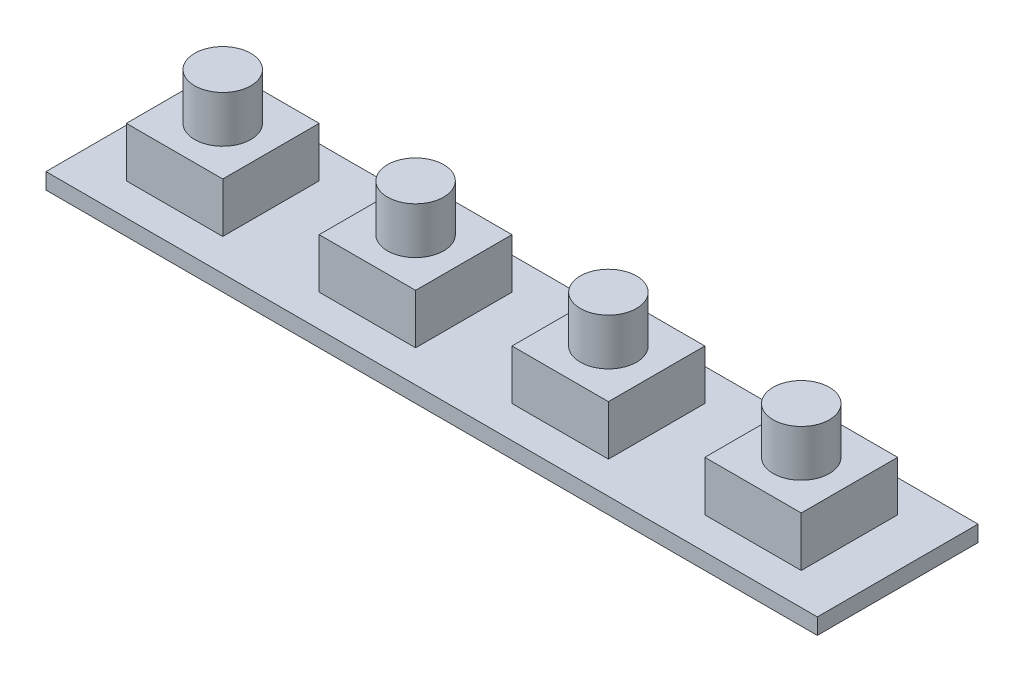
ISO-10303-21;
HEADER;
FILE_DESCRIPTION(('STEP AP214'),'2;1');
FILE_NAME('part.step','',(''),(''),'','','');
FILE_SCHEMA(('AUTOMOTIVE_DESIGN { 1 0 10303 214 1 1 1 1 }'));
ENDSEC;
DATA;
#1=APPLICATION_CONTEXT('core data for automotive mechanical design processes');
#2=APPLICATION_PROTOCOL_DEFINITION('international standard','automotive_design',2000,#1);
#3=PRODUCT_CONTEXT('',#1,'mechanical');
#4=PRODUCT('Part','Part','',(#3));
#5=PRODUCT_RELATED_PRODUCT_CATEGORY('part','',(#4));
#6=PRODUCT_DEFINITION_FORMATION('','',#4);
#7=PRODUCT_DEFINITION_CONTEXT('part definition',#1,'design');
#8=PRODUCT_DEFINITION('design','',#6,#7);
#9=PRODUCT_DEFINITION_SHAPE('','',#8);
#10=(LENGTH_UNIT() NAMED_UNIT(*) SI_UNIT(.MILLI.,.METRE.));
#11=(NAMED_UNIT(*) PLANE_ANGLE_UNIT() SI_UNIT($,.RADIAN.));
#12=(NAMED_UNIT(*) SI_UNIT($,.STERADIAN.) SOLID_ANGLE_UNIT());
#13=UNCERTAINTY_MEASURE_WITH_UNIT(LENGTH_MEASURE(1.E-05),#10,'distance_accuracy_value','');
#14=(GEOMETRIC_REPRESENTATION_CONTEXT(3) GLOBAL_UNCERTAINTY_ASSIGNED_CONTEXT((#13)) GLOBAL_UNIT_ASSIGNED_CONTEXT((#10,
#11,#12)) REPRESENTATION_CONTEXT('',''));
#15=CARTESIAN_POINT('',(0.,0.,0.));
#16=DIRECTION('',(0.,0.,1.));
#17=DIRECTION('',(1.,0.,0.));
#18=AXIS2_PLACEMENT_3D('',#15,#16,#17);
#19=CARTESIAN_POINT('',(0.,1.,0.));
#20=DIRECTION('',(0.,1.,0.));
#21=DIRECTION('',(0.,0.,1.));
#22=AXIS2_PLACEMENT_3D('',#19,#20,#21);
#23=PLANE('',#22);
#24=DIRECTION('',(0.,0.,-1.));
#25=VECTOR('',#24,1.);
#26=CARTESIAN_POINT('',(24.,1.,-5.));
#27=LINE('',#26,#25);
#28=CARTESIAN_POINT('',(24.,1.,5.));
#29=VERTEX_POINT('',#28);
#30=CARTESIAN_POINT('',(24.,1.,-5.));
#31=VERTEX_POINT('',#30);
#32=EDGE_CURVE('E311',#29,#31,#27,.T.);
#33=ORIENTED_EDGE('',*,*,#32,.T.);
#34=DIRECTION('',(-1.,0.,0.));
#35=VECTOR('',#34,1.);
#36=CARTESIAN_POINT('',(-24.,1.,-5.));
#37=LINE('',#36,#35);
#38=CARTESIAN_POINT('',(-24.,1.,-5.));
#39=VERTEX_POINT('',#38);
#40=EDGE_CURVE('E314',#31,#39,#37,.T.);
#41=ORIENTED_EDGE('',*,*,#40,.T.);
#42=DIRECTION('',(0.,0.,1.));
#43=VECTOR('',#42,1.);
#44=CARTESIAN_POINT('',(-24.,1.,-5.));
#45=LINE('',#44,#43);
#46=CARTESIAN_POINT('',(-24.,1.,5.));
#47=VERTEX_POINT('',#46);
#48=EDGE_CURVE('E317',#39,#47,#45,.T.);
#49=ORIENTED_EDGE('',*,*,#48,.T.);
#50=DIRECTION('',(1.,0.,0.));
#51=VECTOR('',#50,1.);
#52=CARTESIAN_POINT('',(-24.,1.,5.));
#53=LINE('',#52,#51);
#54=EDGE_CURVE('E319',#47,#29,#53,.T.);
#55=ORIENTED_EDGE('',*,*,#54,.T.);
#56=EDGE_LOOP('',(#33,#41,#49,#55));
#57=FACE_BOUND('',#56,.T.);
#58=DIRECTION('',(-1.,0.,0.));
#59=VECTOR('',#58,1.);
#60=CARTESIAN_POINT('',(-21.,1.,-3.));
#61=LINE('',#60,#59);
#62=CARTESIAN_POINT('',(-15.,1.,-3.));
#63=VERTEX_POINT('',#62);
#64=CARTESIAN_POINT('',(-21.,1.,-3.));
#65=VERTEX_POINT('',#64);
#66=EDGE_CURVE('E293',#63,#65,#61,.T.);
#67=ORIENTED_EDGE('',*,*,#66,.F.);
#68=DIRECTION('',(0.,0.,-1.));
#69=VECTOR('',#68,1.);
#70=CARTESIAN_POINT('',(-15.,1.,-3.));
#71=LINE('',#70,#69);
#72=CARTESIAN_POINT('',(-15.,1.,3.));
#73=VERTEX_POINT('',#72);
#74=EDGE_CURVE('E290',#73,#63,#71,.T.);
#75=ORIENTED_EDGE('',*,*,#74,.F.);
#76=DIRECTION('',(1.,0.,0.));
#77=VECTOR('',#76,1.);
#78=CARTESIAN_POINT('',(-21.,1.,3.));
#79=LINE('',#78,#77);
#80=CARTESIAN_POINT('',(-21.,1.,3.));
#81=VERTEX_POINT('',#80);
#82=EDGE_CURVE('E298',#81,#73,#79,.T.);
#83=ORIENTED_EDGE('',*,*,#82,.F.);
#84=DIRECTION('',(0.,0.,1.));
#85=VECTOR('',#84,1.);
#86=CARTESIAN_POINT('',(-21.,1.,-3.));
#87=LINE('',#86,#85);
#88=EDGE_CURVE('E295',#65,#81,#87,.T.);
#89=ORIENTED_EDGE('',*,*,#88,.F.);
#90=EDGE_LOOP('',(#67,#75,#83,#89));
#91=FACE_BOUND('',#90,.T.);
#92=DIRECTION('',(-1.,0.,0.));
#93=VECTOR('',#92,1.);
#94=CARTESIAN_POINT('',(-9.00000000000003,1.,-3.));
#95=LINE('',#94,#93);
#96=CARTESIAN_POINT('',(-3.00000000000003,1.,-3.));
#97=VERTEX_POINT('',#96);
#98=CARTESIAN_POINT('',(-9.00000000000003,1.,-3.));
#99=VERTEX_POINT('',#98);
#100=EDGE_CURVE('E273',#97,#99,#95,.T.);
#101=ORIENTED_EDGE('',*,*,#100,.F.);
#102=DIRECTION('',(0.,0.,-1.));
#103=VECTOR('',#102,1.);
#104=CARTESIAN_POINT('',(-3.00000000000003,1.,-3.));
#105=LINE('',#104,#103);
#106=CARTESIAN_POINT('',(-3.00000000000003,1.,3.));
#107=VERTEX_POINT('',#106);
#108=EDGE_CURVE('E270',#107,#97,#105,.T.);
#109=ORIENTED_EDGE('',*,*,#108,.F.);
#110=DIRECTION('',(1.,0.,0.));
#111=VECTOR('',#110,1.);
#112=CARTESIAN_POINT('',(-9.00000000000003,1.,3.));
#113=LINE('',#112,#111);
#114=CARTESIAN_POINT('',(-9.00000000000003,1.,3.));
#115=VERTEX_POINT('',#114);
#116=EDGE_CURVE('E278',#115,#107,#113,.T.);
#117=ORIENTED_EDGE('',*,*,#116,.F.);
#118=DIRECTION('',(0.,0.,1.));
#119=VECTOR('',#118,1.);
#120=CARTESIAN_POINT('',(-9.00000000000003,1.,-3.));
#121=LINE('',#120,#119);
#122=EDGE_CURVE('E275',#99,#115,#121,.T.);
#123=ORIENTED_EDGE('',*,*,#122,.F.);
#124=EDGE_LOOP('',(#101,#109,#117,#123));
#125=FACE_BOUND('',#124,.T.);
#126=DIRECTION('',(-1.,0.,0.));
#127=VECTOR('',#126,1.);
#128=CARTESIAN_POINT('',(2.99999999999998,1.,-3.));
#129=LINE('',#128,#127);
#130=CARTESIAN_POINT('',(8.99999999999998,1.,-3.));
#131=VERTEX_POINT('',#130);
#132=CARTESIAN_POINT('',(2.99999999999998,1.,-3.));
#133=VERTEX_POINT('',#132);
#134=EDGE_CURVE('E255',#131,#133,#129,.T.);
#135=ORIENTED_EDGE('',*,*,#134,.F.);
#136=DIRECTION('',(0.,0.,-1.));
#137=VECTOR('',#136,1.);
#138=CARTESIAN_POINT('',(8.99999999999998,1.,-3.));
#139=LINE('',#138,#137);
#140=CARTESIAN_POINT('',(8.99999999999998,1.,3.));
#141=VERTEX_POINT('',#140);
#142=EDGE_CURVE('E182',#141,#131,#139,.T.);
#143=ORIENTED_EDGE('',*,*,#142,.F.);
#144=DIRECTION('',(1.,0.,0.));
#145=VECTOR('',#144,1.);
#146=CARTESIAN_POINT('',(2.99999999999998,1.,3.));
#147=LINE('',#146,#145);
#148=CARTESIAN_POINT('',(2.99999999999998,1.,3.));
#149=VERTEX_POINT('',#148);
#150=EDGE_CURVE('E259',#149,#141,#147,.T.);
#151=ORIENTED_EDGE('',*,*,#150,.F.);
#152=DIRECTION('',(0.,0.,1.));
#153=VECTOR('',#152,1.);
#154=CARTESIAN_POINT('',(2.99999999999998,1.,-3.));
#155=LINE('',#154,#153);
#156=EDGE_CURVE('E257',#133,#149,#155,.T.);
#157=ORIENTED_EDGE('',*,*,#156,.F.);
#158=EDGE_LOOP('',(#135,#143,#151,#157));
#159=FACE_BOUND('',#158,.T.);
#160=DIRECTION('',(-1.,0.,0.));
#161=VECTOR('',#160,1.);
#162=CARTESIAN_POINT('',(15.,1.,-3.));
#163=LINE('',#162,#161);
#164=CARTESIAN_POINT('',(21.,1.,-3.));
#165=VERTEX_POINT('',#164);
#166=CARTESIAN_POINT('',(15.,1.,-3.));
#167=VERTEX_POINT('',#166);
#168=EDGE_CURVE('E243',#165,#167,#163,.T.);
#169=ORIENTED_EDGE('',*,*,#168,.F.);
#170=DIRECTION('',(0.,0.,-1.));
#171=VECTOR('',#170,1.);
#172=CARTESIAN_POINT('',(21.,1.,-3.));
#173=LINE('',#172,#171);
#174=CARTESIAN_POINT('',(21.,1.,3.));
#175=VERTEX_POINT('',#174);
#176=EDGE_CURVE('E179',#175,#165,#173,.T.);
#177=ORIENTED_EDGE('',*,*,#176,.F.);
#178=DIRECTION('',(1.,0.,0.));
#179=VECTOR('',#178,1.);
#180=CARTESIAN_POINT('',(15.,1.,3.));
#181=LINE('',#180,#179);
#182=CARTESIAN_POINT('',(15.,1.,3.));
#183=VERTEX_POINT('',#182);
#184=EDGE_CURVE('E247',#183,#175,#181,.T.);
#185=ORIENTED_EDGE('',*,*,#184,.F.);
#186=DIRECTION('',(0.,0.,1.));
#187=VECTOR('',#186,1.);
#188=CARTESIAN_POINT('',(15.,1.,-3.));
#189=LINE('',#188,#187);
#190=EDGE_CURVE('E245',#167,#183,#189,.T.);
#191=ORIENTED_EDGE('',*,*,#190,.F.);
#192=EDGE_LOOP('',(#169,#177,#185,#191));
#193=FACE_BOUND('',#192,.T.);
#194=ADVANCED_FACE('F35',(#57,#91,#125,#159,#193),#23,.T.);
#195=CARTESIAN_POINT('',(24.,1.,-5.));
#196=DIRECTION('',(-1.,0.,0.));
#197=DIRECTION('',(0.,0.,1.));
#198=AXIS2_PLACEMENT_3D('',#195,#196,#197);
#199=PLANE('',#198);
#200=DIRECTION('',(0.,0.,-1.));
#201=VECTOR('',#200,1.);
#202=CARTESIAN_POINT('',(24.,0.,-5.));
#203=LINE('',#202,#201);
#204=CARTESIAN_POINT('',(24.,0.,5.));
#205=VERTEX_POINT('',#204);
#206=CARTESIAN_POINT('',(24.,0.,-5.));
#207=VERTEX_POINT('',#206);
#208=EDGE_CURVE('E310',#205,#207,#203,.T.);
#209=ORIENTED_EDGE('',*,*,#208,.T.);
#210=DIRECTION('',(0.,-1.,0.));
#211=VECTOR('',#210,1.);
#212=CARTESIAN_POINT('',(24.,1.,-5.));
#213=LINE('',#212,#211);
#214=EDGE_CURVE('E11',#31,#207,#213,.T.);
#215=ORIENTED_EDGE('',*,*,#214,.F.);
#216=ORIENTED_EDGE('',*,*,#32,.F.);
#217=DIRECTION('',(0.,-1.,0.));
#218=VECTOR('',#217,1.);
#219=CARTESIAN_POINT('',(24.,1.,5.));
#220=LINE('',#219,#218);
#221=EDGE_CURVE('E321',#29,#205,#220,.T.);
#222=ORIENTED_EDGE('',*,*,#221,.T.);
#223=EDGE_LOOP('',(#209,#215,#216,#222));
#224=FACE_BOUND('',#223,.T.);
#225=ADVANCED_FACE('F37',(#224),#199,.F.);
#226=CARTESIAN_POINT('',(-24.,1.,-5.));
#227=DIRECTION('',(0.,0.,1.));
#228=DIRECTION('',(1.,0.,0.));
#229=AXIS2_PLACEMENT_3D('',#226,#227,#228);
#230=PLANE('',#229);
#231=DIRECTION('',(-1.,0.,0.));
#232=VECTOR('',#231,1.);
#233=CARTESIAN_POINT('',(-24.,0.,-5.));
#234=LINE('',#233,#232);
#235=CARTESIAN_POINT('',(-24.,0.,-5.));
#236=VERTEX_POINT('',#235);
#237=EDGE_CURVE('E324',#207,#236,#234,.T.);
#238=ORIENTED_EDGE('',*,*,#237,.T.);
#239=DIRECTION('',(0.,-1.,0.));
#240=VECTOR('',#239,1.);
#241=CARTESIAN_POINT('',(-24.,1.,-5.));
#242=LINE('',#241,#240);
#243=EDGE_CURVE('E43',#39,#236,#242,.T.);
#244=ORIENTED_EDGE('',*,*,#243,.F.);
#245=ORIENTED_EDGE('',*,*,#40,.F.);
#246=ORIENTED_EDGE('',*,*,#214,.T.);
#247=EDGE_LOOP('',(#238,#244,#245,#246));
#248=FACE_BOUND('',#247,.T.);
#249=ADVANCED_FACE('F354',(#248),#230,.F.);
#250=CARTESIAN_POINT('',(-24.,1.,-5.));
#251=DIRECTION('',(1.,0.,0.));
#252=DIRECTION('',(0.,0.,-1.));
#253=AXIS2_PLACEMENT_3D('',#250,#251,#252);
#254=PLANE('',#253);
#255=DIRECTION('',(0.,0.,1.));
#256=VECTOR('',#255,1.);
#257=CARTESIAN_POINT('',(-24.,0.,-5.));
#258=LINE('',#257,#256);
#259=CARTESIAN_POINT('',(-24.,0.,5.));
#260=VERTEX_POINT('',#259);
#261=EDGE_CURVE('E326',#236,#260,#258,.T.);
#262=ORIENTED_EDGE('',*,*,#261,.T.);
#263=DIRECTION('',(0.,-1.,0.));
#264=VECTOR('',#263,1.);
#265=CARTESIAN_POINT('',(-24.,1.,5.));
#266=LINE('',#265,#264);
#267=EDGE_CURVE('E331',#47,#260,#266,.T.);
#268=ORIENTED_EDGE('',*,*,#267,.F.);
#269=ORIENTED_EDGE('',*,*,#48,.F.);
#270=ORIENTED_EDGE('',*,*,#243,.T.);
#271=EDGE_LOOP('',(#262,#268,#269,#270));
#272=FACE_BOUND('',#271,.T.);
#273=ADVANCED_FACE('F338',(#272),#254,.F.);
#274=CARTESIAN_POINT('',(-24.,1.,5.));
#275=DIRECTION('',(0.,0.,-1.));
#276=DIRECTION('',(-1.,0.,0.));
#277=AXIS2_PLACEMENT_3D('',#274,#275,#276);
#278=PLANE('',#277);
#279=DIRECTION('',(1.,0.,0.));
#280=VECTOR('',#279,1.);
#281=CARTESIAN_POINT('',(-24.,0.,5.));
#282=LINE('',#281,#280);
#283=EDGE_CURVE('E315',#260,#205,#282,.T.);
#284=ORIENTED_EDGE('',*,*,#283,.T.);
#285=ORIENTED_EDGE('',*,*,#221,.F.);
#286=ORIENTED_EDGE('',*,*,#54,.F.);
#287=ORIENTED_EDGE('',*,*,#267,.T.);
#288=EDGE_LOOP('',(#284,#285,#286,#287));
#289=FACE_BOUND('',#288,.T.);
#290=ADVANCED_FACE('F347',(#289),#278,.F.);
#291=CARTESIAN_POINT('',(0.,0.,0.));
#292=DIRECTION('',(0.,1.,0.));
#293=DIRECTION('',(0.,0.,1.));
#294=AXIS2_PLACEMENT_3D('',#291,#292,#293);
#295=PLANE('',#294);
#296=ORIENTED_EDGE('',*,*,#208,.F.);
#297=ORIENTED_EDGE('',*,*,#283,.F.);
#298=ORIENTED_EDGE('',*,*,#261,.F.);
#299=ORIENTED_EDGE('',*,*,#237,.F.);
#300=EDGE_LOOP('',(#296,#297,#298,#299));
#301=FACE_BOUND('',#300,.T.);
#302=ADVANCED_FACE('F344',(#301),#295,.F.);
#303=CARTESIAN_POINT('',(-15.,4.,-3.));
#304=DIRECTION('',(-1.,0.,0.));
#305=DIRECTION('',(0.,0.,1.));
#306=AXIS2_PLACEMENT_3D('',#303,#304,#305);
#307=PLANE('',#306);
#308=ORIENTED_EDGE('',*,*,#74,.T.);
#309=DIRECTION('',(0.,-1.,0.));
#310=VECTOR('',#309,1.);
#311=CARTESIAN_POINT('',(-15.,4.,-3.));
#312=LINE('',#311,#310);
#313=CARTESIAN_POINT('',(-15.,4.1,-3.));
#314=VERTEX_POINT('',#313);
#315=EDGE_CURVE('E308',#314,#63,#312,.T.);
#316=ORIENTED_EDGE('',*,*,#315,.F.);
#317=DIRECTION('',(0.,0.,-1.));
#318=VECTOR('',#317,1.);
#319=CARTESIAN_POINT('',(-15.,4.1,-3.));
#320=LINE('',#319,#318);
#321=CARTESIAN_POINT('',(-15.,4.1,3.));
#322=VERTEX_POINT('',#321);
#323=EDGE_CURVE('E230',#322,#314,#320,.T.);
#324=ORIENTED_EDGE('',*,*,#323,.F.);
#325=DIRECTION('',(0.,-1.,0.));
#326=VECTOR('',#325,1.);
#327=CARTESIAN_POINT('',(-15.,4.,3.));
#328=LINE('',#327,#326);
#329=EDGE_CURVE('E300',#322,#73,#328,.T.);
#330=ORIENTED_EDGE('',*,*,#329,.T.);
#331=EDGE_LOOP('',(#308,#316,#324,#330));
#332=FACE_BOUND('',#331,.T.);
#333=ADVANCED_FACE('F367',(#332),#307,.F.);
#334=CARTESIAN_POINT('',(-21.,4.,-3.));
#335=DIRECTION('',(0.,0.,1.));
#336=DIRECTION('',(1.,0.,0.));
#337=AXIS2_PLACEMENT_3D('',#334,#335,#336);
#338=PLANE('',#337);
#339=ORIENTED_EDGE('',*,*,#66,.T.);
#340=DIRECTION('',(0.,-1.,0.));
#341=VECTOR('',#340,1.);
#342=CARTESIAN_POINT('',(-21.,4.,-3.));
#343=LINE('',#342,#341);
#344=CARTESIAN_POINT('',(-21.,4.1,-3.));
#345=VERTEX_POINT('',#344);
#346=EDGE_CURVE('E305',#345,#65,#343,.T.);
#347=ORIENTED_EDGE('',*,*,#346,.F.);
#348=DIRECTION('',(-1.,0.,0.));
#349=VECTOR('',#348,1.);
#350=CARTESIAN_POINT('',(-21.,4.1,-3.));
#351=LINE('',#350,#349);
#352=EDGE_CURVE('E233',#314,#345,#351,.T.);
#353=ORIENTED_EDGE('',*,*,#352,.F.);
#354=ORIENTED_EDGE('',*,*,#315,.T.);
#355=EDGE_LOOP('',(#339,#347,#353,#354));
#356=FACE_BOUND('',#355,.T.);
#357=ADVANCED_FACE('F386',(#356),#338,.F.);
#358=CARTESIAN_POINT('',(-21.,4.,-3.));
#359=DIRECTION('',(1.,0.,0.));
#360=DIRECTION('',(0.,0.,-1.));
#361=AXIS2_PLACEMENT_3D('',#358,#359,#360);
#362=PLANE('',#361);
#363=ORIENTED_EDGE('',*,*,#88,.T.);
#364=DIRECTION('',(0.,-1.,0.));
#365=VECTOR('',#364,1.);
#366=CARTESIAN_POINT('',(-21.,4.,3.));
#367=LINE('',#366,#365);
#368=CARTESIAN_POINT('',(-21.,4.1,3.));
#369=VERTEX_POINT('',#368);
#370=EDGE_CURVE('E303',#369,#81,#367,.T.);
#371=ORIENTED_EDGE('',*,*,#370,.F.);
#372=DIRECTION('',(0.,0.,1.));
#373=VECTOR('',#372,1.);
#374=CARTESIAN_POINT('',(-21.,4.1,-3.));
#375=LINE('',#374,#373);
#376=EDGE_CURVE('E236',#345,#369,#375,.T.);
#377=ORIENTED_EDGE('',*,*,#376,.F.);
#378=ORIENTED_EDGE('',*,*,#346,.T.);
#379=EDGE_LOOP('',(#363,#371,#377,#378));
#380=FACE_BOUND('',#379,.T.);
#381=ADVANCED_FACE('F393',(#380),#362,.F.);
#382=CARTESIAN_POINT('',(-21.,4.,3.));
#383=DIRECTION('',(0.,0.,-1.));
#384=DIRECTION('',(-1.,0.,0.));
#385=AXIS2_PLACEMENT_3D('',#382,#383,#384);
#386=PLANE('',#385);
#387=ORIENTED_EDGE('',*,*,#82,.T.);
#388=ORIENTED_EDGE('',*,*,#329,.F.);
#389=DIRECTION('',(1.,0.,0.));
#390=VECTOR('',#389,1.);
#391=CARTESIAN_POINT('',(-21.,4.1,3.));
#392=LINE('',#391,#390);
#393=EDGE_CURVE('E239',#369,#322,#392,.T.);
#394=ORIENTED_EDGE('',*,*,#393,.F.);
#395=ORIENTED_EDGE('',*,*,#370,.T.);
#396=EDGE_LOOP('',(#387,#388,#394,#395));
#397=FACE_BOUND('',#396,.T.);
#398=ADVANCED_FACE('F400',(#397),#386,.F.);
#399=CARTESIAN_POINT('',(-3.00000000000003,4.,-3.));
#400=DIRECTION('',(-1.,0.,0.));
#401=DIRECTION('',(0.,0.,1.));
#402=AXIS2_PLACEMENT_3D('',#399,#400,#401);
#403=PLANE('',#402);
#404=ORIENTED_EDGE('',*,*,#108,.T.);
#405=DIRECTION('',(0.,-1.,0.));
#406=VECTOR('',#405,1.);
#407=CARTESIAN_POINT('',(-3.00000000000003,4.,-3.));
#408=LINE('',#407,#406);
#409=CARTESIAN_POINT('',(-3.00000000000003,4.1,-3.));
#410=VERTEX_POINT('',#409);
#411=EDGE_CURVE('E288',#410,#97,#408,.T.);
#412=ORIENTED_EDGE('',*,*,#411,.F.);
#413=DIRECTION('',(0.,0.,-1.));
#414=VECTOR('',#413,1.);
#415=CARTESIAN_POINT('',(-3.00000000000003,4.1,-3.));
#416=LINE('',#415,#414);
#417=CARTESIAN_POINT('',(-3.00000000000003,4.1,3.));
#418=VERTEX_POINT('',#417);
#419=EDGE_CURVE('E218',#418,#410,#416,.T.);
#420=ORIENTED_EDGE('',*,*,#419,.F.);
#421=DIRECTION('',(0.,-1.,0.));
#422=VECTOR('',#421,1.);
#423=CARTESIAN_POINT('',(-3.00000000000003,4.,3.));
#424=LINE('',#423,#422);
#425=EDGE_CURVE('E280',#418,#107,#424,.T.);
#426=ORIENTED_EDGE('',*,*,#425,.T.);
#427=EDGE_LOOP('',(#404,#412,#420,#426));
#428=FACE_BOUND('',#427,.T.);
#429=ADVANCED_FACE('F408',(#428),#403,.F.);
#430=CARTESIAN_POINT('',(-9.00000000000003,4.,-3.));
#431=DIRECTION('',(0.,0.,1.));
#432=DIRECTION('',(1.,0.,0.));
#433=AXIS2_PLACEMENT_3D('',#430,#431,#432);
#434=PLANE('',#433);
#435=ORIENTED_EDGE('',*,*,#100,.T.);
#436=DIRECTION('',(0.,-1.,0.));
#437=VECTOR('',#436,1.);
#438=CARTESIAN_POINT('',(-9.00000000000003,4.,-3.));
#439=LINE('',#438,#437);
#440=CARTESIAN_POINT('',(-9.00000000000003,4.1,-3.));
#441=VERTEX_POINT('',#440);
#442=EDGE_CURVE('E285',#441,#99,#439,.T.);
#443=ORIENTED_EDGE('',*,*,#442,.F.);
#444=DIRECTION('',(-1.,0.,0.));
#445=VECTOR('',#444,1.);
#446=CARTESIAN_POINT('',(-9.00000000000003,4.1,-3.));
#447=LINE('',#446,#445);
#448=EDGE_CURVE('E221',#410,#441,#447,.T.);
#449=ORIENTED_EDGE('',*,*,#448,.F.);
#450=ORIENTED_EDGE('',*,*,#411,.T.);
#451=EDGE_LOOP('',(#435,#443,#449,#450));
#452=FACE_BOUND('',#451,.T.);
#453=ADVANCED_FACE('F416',(#452),#434,.F.);
#454=CARTESIAN_POINT('',(-9.00000000000003,4.,-3.));
#455=DIRECTION('',(1.,0.,0.));
#456=DIRECTION('',(0.,0.,-1.));
#457=AXIS2_PLACEMENT_3D('',#454,#455,#456);
#458=PLANE('',#457);
#459=ORIENTED_EDGE('',*,*,#122,.T.);
#460=DIRECTION('',(0.,-1.,0.));
#461=VECTOR('',#460,1.);
#462=CARTESIAN_POINT('',(-9.00000000000003,4.,3.));
#463=LINE('',#462,#461);
#464=CARTESIAN_POINT('',(-9.00000000000003,4.1,3.));
#465=VERTEX_POINT('',#464);
#466=EDGE_CURVE('E283',#465,#115,#463,.T.);
#467=ORIENTED_EDGE('',*,*,#466,.F.);
#468=DIRECTION('',(0.,0.,1.));
#469=VECTOR('',#468,1.);
#470=CARTESIAN_POINT('',(-9.00000000000003,4.1,-3.));
#471=LINE('',#470,#469);
#472=EDGE_CURVE('E224',#441,#465,#471,.T.);
#473=ORIENTED_EDGE('',*,*,#472,.F.);
#474=ORIENTED_EDGE('',*,*,#442,.T.);
#475=EDGE_LOOP('',(#459,#467,#473,#474));
#476=FACE_BOUND('',#475,.T.);
#477=ADVANCED_FACE('F424',(#476),#458,.F.);
#478=CARTESIAN_POINT('',(-9.00000000000003,4.,3.));
#479=DIRECTION('',(0.,0.,-1.));
#480=DIRECTION('',(-1.,0.,0.));
#481=AXIS2_PLACEMENT_3D('',#478,#479,#480);
#482=PLANE('',#481);
#483=ORIENTED_EDGE('',*,*,#116,.T.);
#484=ORIENTED_EDGE('',*,*,#425,.F.);
#485=DIRECTION('',(1.,0.,0.));
#486=VECTOR('',#485,1.);
#487=CARTESIAN_POINT('',(-9.00000000000003,4.1,3.));
#488=LINE('',#487,#486);
#489=EDGE_CURVE('E227',#465,#418,#488,.T.);
#490=ORIENTED_EDGE('',*,*,#489,.F.);
#491=ORIENTED_EDGE('',*,*,#466,.T.);
#492=EDGE_LOOP('',(#483,#484,#490,#491));
#493=FACE_BOUND('',#492,.T.);
#494=ADVANCED_FACE('F432',(#493),#482,.F.);
#495=CARTESIAN_POINT('',(8.99999999999998,4.,-3.));
#496=DIRECTION('',(-1.,0.,0.));
#497=DIRECTION('',(0.,0.,1.));
#498=AXIS2_PLACEMENT_3D('',#495,#496,#497);
#499=PLANE('',#498);
#500=ORIENTED_EDGE('',*,*,#142,.T.);
#501=DIRECTION('',(0.,-1.,0.));
#502=VECTOR('',#501,1.);
#503=CARTESIAN_POINT('',(8.99999999999998,4.,-3.));
#504=LINE('',#503,#502);
#505=CARTESIAN_POINT('',(8.99999999999998,4.1,-3.));
#506=VERTEX_POINT('',#505);
#507=EDGE_CURVE('E268',#506,#131,#504,.T.);
#508=ORIENTED_EDGE('',*,*,#507,.F.);
#509=DIRECTION('',(0.,0.,-1.));
#510=VECTOR('',#509,1.);
#511=CARTESIAN_POINT('',(8.99999999999998,4.1,-3.));
#512=LINE('',#511,#510);
#513=CARTESIAN_POINT('',(8.99999999999998,4.1,3.));
#514=VERTEX_POINT('',#513);
#515=EDGE_CURVE('E206',#514,#506,#512,.T.);
#516=ORIENTED_EDGE('',*,*,#515,.F.);
#517=DIRECTION('',(0.,-1.,0.));
#518=VECTOR('',#517,1.);
#519=CARTESIAN_POINT('',(8.99999999999998,4.,3.));
#520=LINE('',#519,#518);
#521=EDGE_CURVE('E261',#514,#141,#520,.T.);
#522=ORIENTED_EDGE('',*,*,#521,.T.);
#523=EDGE_LOOP('',(#500,#508,#516,#522));
#524=FACE_BOUND('',#523,.T.);
#525=ADVANCED_FACE('F440',(#524),#499,.F.);
#526=CARTESIAN_POINT('',(2.99999999999998,4.,-3.));
#527=DIRECTION('',(0.,0.,1.));
#528=DIRECTION('',(1.,0.,0.));
#529=AXIS2_PLACEMENT_3D('',#526,#527,#528);
#530=PLANE('',#529);
#531=ORIENTED_EDGE('',*,*,#134,.T.);
#532=DIRECTION('',(0.,-1.,0.));
#533=VECTOR('',#532,1.);
#534=CARTESIAN_POINT('',(2.99999999999998,4.,-3.));
#535=LINE('',#534,#533);
#536=CARTESIAN_POINT('',(2.99999999999998,4.1,-3.));
#537=VERTEX_POINT('',#536);
#538=EDGE_CURVE('E265',#537,#133,#535,.T.);
#539=ORIENTED_EDGE('',*,*,#538,.F.);
#540=DIRECTION('',(-1.,0.,0.));
#541=VECTOR('',#540,1.);
#542=CARTESIAN_POINT('',(2.99999999999998,4.1,-3.));
#543=LINE('',#542,#541);
#544=EDGE_CURVE('E209',#506,#537,#543,.T.);
#545=ORIENTED_EDGE('',*,*,#544,.F.);
#546=ORIENTED_EDGE('',*,*,#507,.T.);
#547=EDGE_LOOP('',(#531,#539,#545,#546));
#548=FACE_BOUND('',#547,.T.);
#549=ADVANCED_FACE('F448',(#548),#530,.F.);
#550=CARTESIAN_POINT('',(2.99999999999998,4.,-3.));
#551=DIRECTION('',(1.,0.,0.));
#552=DIRECTION('',(0.,0.,-1.));
#553=AXIS2_PLACEMENT_3D('',#550,#551,#552);
#554=PLANE('',#553);
#555=ORIENTED_EDGE('',*,*,#156,.T.);
#556=DIRECTION('',(0.,-1.,0.));
#557=VECTOR('',#556,1.);
#558=CARTESIAN_POINT('',(2.99999999999998,4.,3.));
#559=LINE('',#558,#557);
#560=CARTESIAN_POINT('',(2.99999999999998,4.1,3.));
#561=VERTEX_POINT('',#560);
#562=EDGE_CURVE('E58',#561,#149,#559,.T.);
#563=ORIENTED_EDGE('',*,*,#562,.F.);
#564=DIRECTION('',(0.,0.,1.));
#565=VECTOR('',#564,1.);
#566=CARTESIAN_POINT('',(2.99999999999998,4.1,-3.));
#567=LINE('',#566,#565);
#568=EDGE_CURVE('E212',#537,#561,#567,.T.);
#569=ORIENTED_EDGE('',*,*,#568,.F.);
#570=ORIENTED_EDGE('',*,*,#538,.T.);
#571=EDGE_LOOP('',(#555,#563,#569,#570));
#572=FACE_BOUND('',#571,.T.);
#573=ADVANCED_FACE('F456',(#572),#554,.F.);
#574=CARTESIAN_POINT('',(2.99999999999998,4.,3.));
#575=DIRECTION('',(0.,0.,-1.));
#576=DIRECTION('',(-1.,0.,0.));
#577=AXIS2_PLACEMENT_3D('',#574,#575,#576);
#578=PLANE('',#577);
#579=ORIENTED_EDGE('',*,*,#150,.T.);
#580=ORIENTED_EDGE('',*,*,#521,.F.);
#581=DIRECTION('',(1.,0.,0.));
#582=VECTOR('',#581,1.);
#583=CARTESIAN_POINT('',(2.99999999999998,4.1,3.));
#584=LINE('',#583,#582);
#585=EDGE_CURVE('E215',#561,#514,#584,.T.);
#586=ORIENTED_EDGE('',*,*,#585,.F.);
#587=ORIENTED_EDGE('',*,*,#562,.T.);
#588=EDGE_LOOP('',(#579,#580,#586,#587));
#589=FACE_BOUND('',#588,.T.);
#590=ADVANCED_FACE('F464',(#589),#578,.F.);
#591=CARTESIAN_POINT('',(21.,4.,-3.));
#592=DIRECTION('',(-1.,0.,0.));
#593=DIRECTION('',(0.,0.,1.));
#594=AXIS2_PLACEMENT_3D('',#591,#592,#593);
#595=PLANE('',#594);
#596=ORIENTED_EDGE('',*,*,#176,.T.);
#597=DIRECTION('',(0.,-1.,0.));
#598=VECTOR('',#597,1.);
#599=CARTESIAN_POINT('',(21.,4.,-3.));
#600=LINE('',#599,#598);
#601=CARTESIAN_POINT('',(21.,4.1,-3.));
#602=VERTEX_POINT('',#601);
#603=EDGE_CURVE('E172',#602,#165,#600,.T.);
#604=ORIENTED_EDGE('',*,*,#603,.F.);
#605=DIRECTION('',(0.,0.,-1.));
#606=VECTOR('',#605,1.);
#607=CARTESIAN_POINT('',(21.,4.1,-3.));
#608=LINE('',#607,#606);
#609=CARTESIAN_POINT('',(21.,4.1,3.));
#610=VERTEX_POINT('',#609);
#611=EDGE_CURVE('E177',#610,#602,#608,.T.);
#612=ORIENTED_EDGE('',*,*,#611,.F.);
#613=DIRECTION('',(0.,-1.,0.));
#614=VECTOR('',#613,1.);
#615=CARTESIAN_POINT('',(21.,4.,3.));
#616=LINE('',#615,#614);
#617=EDGE_CURVE('E249',#610,#175,#616,.T.);
#618=ORIENTED_EDGE('',*,*,#617,.T.);
#619=EDGE_LOOP('',(#596,#604,#612,#618));
#620=FACE_BOUND('',#619,.T.);
#621=ADVANCED_FACE('F174',(#620),#595,.F.);
#622=CARTESIAN_POINT('',(15.,4.,-3.));
#623=DIRECTION('',(0.,0.,1.));
#624=DIRECTION('',(1.,0.,0.));
#625=AXIS2_PLACEMENT_3D('',#622,#623,#624);
#626=PLANE('',#625);
#627=ORIENTED_EDGE('',*,*,#168,.T.);
#628=DIRECTION('',(0.,-1.,0.));
#629=VECTOR('',#628,1.);
#630=CARTESIAN_POINT('',(15.,4.,-3.));
#631=LINE('',#630,#629);
#632=CARTESIAN_POINT('',(15.,4.1,-3.));
#633=VERTEX_POINT('',#632);
#634=EDGE_CURVE('E183',#633,#167,#631,.T.);
#635=ORIENTED_EDGE('',*,*,#634,.F.);
#636=DIRECTION('',(-1.,0.,0.));
#637=VECTOR('',#636,1.);
#638=CARTESIAN_POINT('',(15.,4.1,-3.));
#639=LINE('',#638,#637);
#640=EDGE_CURVE('E186',#602,#633,#639,.T.);
#641=ORIENTED_EDGE('',*,*,#640,.F.);
#642=ORIENTED_EDGE('',*,*,#603,.T.);
#643=EDGE_LOOP('',(#627,#635,#641,#642));
#644=FACE_BOUND('',#643,.T.);
#645=ADVANCED_FACE('F187',(#644),#626,.F.);
#646=CARTESIAN_POINT('',(15.,4.,-3.));
#647=DIRECTION('',(1.,0.,0.));
#648=DIRECTION('',(0.,0.,-1.));
#649=AXIS2_PLACEMENT_3D('',#646,#647,#648);
#650=PLANE('',#649);
#651=ORIENTED_EDGE('',*,*,#190,.T.);
#652=DIRECTION('',(0.,-1.,0.));
#653=VECTOR('',#652,1.);
#654=CARTESIAN_POINT('',(15.,4.,3.));
#655=LINE('',#654,#653);
#656=CARTESIAN_POINT('',(15.,4.1,3.));
#657=VERTEX_POINT('',#656);
#658=EDGE_CURVE('E50',#657,#183,#655,.T.);
#659=ORIENTED_EDGE('',*,*,#658,.F.);
#660=DIRECTION('',(0.,0.,1.));
#661=VECTOR('',#660,1.);
#662=CARTESIAN_POINT('',(15.,4.1,-3.));
#663=LINE('',#662,#661);
#664=EDGE_CURVE('E192',#633,#657,#663,.T.);
#665=ORIENTED_EDGE('',*,*,#664,.F.);
#666=ORIENTED_EDGE('',*,*,#634,.T.);
#667=EDGE_LOOP('',(#651,#659,#665,#666));
#668=FACE_BOUND('',#667,.T.);
#669=ADVANCED_FACE('F484',(#668),#650,.F.);
#670=CARTESIAN_POINT('',(15.,4.,3.));
#671=DIRECTION('',(0.,0.,-1.));
#672=DIRECTION('',(-1.,0.,0.));
#673=AXIS2_PLACEMENT_3D('',#670,#671,#672);
#674=PLANE('',#673);
#675=ORIENTED_EDGE('',*,*,#184,.T.);
#676=ORIENTED_EDGE('',*,*,#617,.F.);
#677=DIRECTION('',(1.,0.,0.));
#678=VECTOR('',#677,1.);
#679=CARTESIAN_POINT('',(15.,4.1,3.));
#680=LINE('',#679,#678);
#681=EDGE_CURVE('E196',#657,#610,#680,.T.);
#682=ORIENTED_EDGE('',*,*,#681,.F.);
#683=ORIENTED_EDGE('',*,*,#658,.T.);
#684=EDGE_LOOP('',(#675,#676,#682,#683));
#685=FACE_BOUND('',#684,.T.);
#686=ADVANCED_FACE('F491',(#685),#674,.F.);
#687=CARTESIAN_POINT('',(0.,4.1,0.));
#688=DIRECTION('',(0.,1.,0.));
#689=DIRECTION('',(0.,0.,1.));
#690=AXIS2_PLACEMENT_3D('',#687,#688,#689);
#691=PLANE('',#690);
#692=CARTESIAN_POINT('',(-18.,4.1,0.));
#693=DIRECTION('',(0.,1.,0.));
#694=DIRECTION('',(0.,0.,1.));
#695=AXIS2_PLACEMENT_3D('',#692,#693,#694);
#696=CIRCLE('',#695,1.75);
#697=CARTESIAN_POINT('',(-18.,4.1,1.75));
#698=VERTEX_POINT('',#697);
#699=EDGE_CURVE('E200',#698,#698,#696,.T.);
#700=ORIENTED_EDGE('',*,*,#699,.F.);
#701=EDGE_LOOP('',(#700));
#702=FACE_BOUND('',#701,.T.);
#703=ORIENTED_EDGE('',*,*,#323,.T.);
#704=ORIENTED_EDGE('',*,*,#352,.T.);
#705=ORIENTED_EDGE('',*,*,#376,.T.);
#706=ORIENTED_EDGE('',*,*,#393,.T.);
#707=EDGE_LOOP('',(#703,#704,#705,#706));
#708=FACE_BOUND('',#707,.T.);
#709=ADVANCED_FACE('F499',(#702,#708),#691,.T.);
#710=CARTESIAN_POINT('',(0.,4.1,0.));
#711=DIRECTION('',(0.,1.,0.));
#712=DIRECTION('',(0.,0.,1.));
#713=AXIS2_PLACEMENT_3D('',#710,#711,#712);
#714=PLANE('',#713);
#715=CARTESIAN_POINT('',(-6.00000000000003,4.1,0.));
#716=DIRECTION('',(0.,1.,0.));
#717=DIRECTION('',(0.,0.,1.));
#718=AXIS2_PLACEMENT_3D('',#715,#716,#717);
#719=CIRCLE('',#718,1.75);
#720=CARTESIAN_POINT('',(-6.00000000000003,4.1,1.75));
#721=VERTEX_POINT('',#720);
#722=EDGE_CURVE('E726',#721,#721,#719,.T.);
#723=ORIENTED_EDGE('',*,*,#722,.F.);
#724=EDGE_LOOP('',(#723));
#725=FACE_BOUND('',#724,.T.);
#726=ORIENTED_EDGE('',*,*,#419,.T.);
#727=ORIENTED_EDGE('',*,*,#448,.T.);
#728=ORIENTED_EDGE('',*,*,#472,.T.);
#729=ORIENTED_EDGE('',*,*,#489,.T.);
#730=EDGE_LOOP('',(#726,#727,#728,#729));
#731=FACE_BOUND('',#730,.T.);
#732=ADVANCED_FACE('F506',(#725,#731),#714,.T.);
#733=CARTESIAN_POINT('',(0.,4.1,0.));
#734=DIRECTION('',(0.,1.,0.));
#735=DIRECTION('',(0.,0.,1.));
#736=AXIS2_PLACEMENT_3D('',#733,#734,#735);
#737=PLANE('',#736);
#738=CARTESIAN_POINT('',(5.99999999999998,4.1,0.));
#739=DIRECTION('',(0.,1.,0.));
#740=DIRECTION('',(0.,0.,1.));
#741=AXIS2_PLACEMENT_3D('',#738,#739,#740);
#742=CIRCLE('',#741,1.75);
#743=CARTESIAN_POINT('',(5.99999999999998,4.1,1.75));
#744=VERTEX_POINT('',#743);
#745=EDGE_CURVE('E725',#744,#744,#742,.T.);
#746=ORIENTED_EDGE('',*,*,#745,.F.);
#747=EDGE_LOOP('',(#746));
#748=FACE_BOUND('',#747,.T.);
#749=ORIENTED_EDGE('',*,*,#515,.T.);
#750=ORIENTED_EDGE('',*,*,#544,.T.);
#751=ORIENTED_EDGE('',*,*,#568,.T.);
#752=ORIENTED_EDGE('',*,*,#585,.T.);
#753=EDGE_LOOP('',(#749,#750,#751,#752));
#754=FACE_BOUND('',#753,.T.);
#755=ADVANCED_FACE('F514',(#748,#754),#737,.T.);
#756=CARTESIAN_POINT('',(0.,4.1,0.));
#757=DIRECTION('',(0.,1.,0.));
#758=DIRECTION('',(0.,0.,1.));
#759=AXIS2_PLACEMENT_3D('',#756,#757,#758);
#760=PLANE('',#759);
#761=CARTESIAN_POINT('',(18.,4.1,0.));
#762=DIRECTION('',(0.,1.,0.));
#763=DIRECTION('',(0.,0.,1.));
#764=AXIS2_PLACEMENT_3D('',#761,#762,#763);
#765=CIRCLE('',#764,1.75);
#766=CARTESIAN_POINT('',(18.,4.1,1.75));
#767=VERTEX_POINT('',#766);
#768=EDGE_CURVE('E735',#767,#767,#765,.T.);
#769=ORIENTED_EDGE('',*,*,#768,.F.);
#770=EDGE_LOOP('',(#769));
#771=FACE_BOUND('',#770,.T.);
#772=ORIENTED_EDGE('',*,*,#611,.T.);
#773=ORIENTED_EDGE('',*,*,#640,.T.);
#774=ORIENTED_EDGE('',*,*,#664,.T.);
#775=ORIENTED_EDGE('',*,*,#681,.T.);
#776=EDGE_LOOP('',(#772,#773,#774,#775));
#777=FACE_BOUND('',#776,.T.);
#778=ADVANCED_FACE('F195',(#771,#777),#760,.T.);
#779=CARTESIAN_POINT('',(-18.,7.,0.));
#780=DIRECTION('',(0.,-1.,0.));
#781=DIRECTION('',(0.,0.,-1.));
#782=AXIS2_PLACEMENT_3D('',#779,#780,#781);
#783=CYLINDRICAL_SURFACE('',#782,1.75);
#784=CARTESIAN_POINT('',(-18.,7.,0.));
#785=DIRECTION('',(0.,1.,0.));
#786=DIRECTION('',(0.,0.,1.));
#787=AXIS2_PLACEMENT_3D('',#784,#785,#786);
#788=CIRCLE('',#787,1.75);
#789=CARTESIAN_POINT('',(-18.,7.,1.75));
#790=VERTEX_POINT('',#789);
#791=EDGE_CURVE('E197',#790,#790,#788,.T.);
#792=ORIENTED_EDGE('',*,*,#791,.F.);
#793=EDGE_LOOP('',(#792));
#794=FACE_BOUND('',#793,.T.);
#795=ORIENTED_EDGE('',*,*,#699,.T.);
#796=EDGE_LOOP('',(#795));
#797=FACE_BOUND('',#796,.T.);
#798=ADVANCED_FACE('F529',(#794,#797),#783,.T.);
#799=CARTESIAN_POINT('',(0.,7.,0.));
#800=DIRECTION('',(0.,1.,0.));
#801=DIRECTION('',(0.,0.,1.));
#802=AXIS2_PLACEMENT_3D('',#799,#800,#801);
#803=PLANE('',#802);
#804=ORIENTED_EDGE('',*,*,#791,.T.);
#805=EDGE_LOOP('',(#804));
#806=FACE_BOUND('',#805,.T.);
#807=ADVANCED_FACE('F537',(#806),#803,.T.);
#808=CARTESIAN_POINT('',(18.,7.,0.));
#809=DIRECTION('',(0.,-1.,0.));
#810=DIRECTION('',(0.,0.,-1.));
#811=AXIS2_PLACEMENT_3D('',#808,#809,#810);
#812=CYLINDRICAL_SURFACE('',#811,1.75);
#813=CARTESIAN_POINT('',(18.,7.,0.));
#814=DIRECTION('',(0.,1.,0.));
#815=DIRECTION('',(0.,0.,1.));
#816=AXIS2_PLACEMENT_3D('',#813,#814,#815);
#817=CIRCLE('',#816,1.75);
#818=CARTESIAN_POINT('',(18.,7.,1.75));
#819=VERTEX_POINT('',#818);
#820=EDGE_CURVE('E737',#819,#819,#817,.T.);
#821=ORIENTED_EDGE('',*,*,#820,.F.);
#822=EDGE_LOOP('',(#821));
#823=FACE_BOUND('',#822,.T.);
#824=ORIENTED_EDGE('',*,*,#768,.T.);
#825=EDGE_LOOP('',(#824));
#826=FACE_BOUND('',#825,.T.);
#827=ADVANCED_FACE('F545',(#823,#826),#812,.T.);
#828=CARTESIAN_POINT('',(0.,7.,0.));
#829=DIRECTION('',(0.,1.,0.));
#830=DIRECTION('',(0.,0.,1.));
#831=AXIS2_PLACEMENT_3D('',#828,#829,#830);
#832=PLANE('',#831);
#833=ORIENTED_EDGE('',*,*,#820,.T.);
#834=EDGE_LOOP('',(#833));
#835=FACE_BOUND('',#834,.T.);
#836=ADVANCED_FACE('F553',(#835),#832,.T.);
#837=CARTESIAN_POINT('',(5.99999999999998,7.,0.));
#838=DIRECTION('',(0.,-1.,0.));
#839=DIRECTION('',(0.,0.,-1.));
#840=AXIS2_PLACEMENT_3D('',#837,#838,#839);
#841=CYLINDRICAL_SURFACE('',#840,1.75);
#842=CARTESIAN_POINT('',(5.99999999999998,7.,0.));
#843=DIRECTION('',(0.,1.,0.));
#844=DIRECTION('',(0.,0.,1.));
#845=AXIS2_PLACEMENT_3D('',#842,#843,#844);
#846=CIRCLE('',#845,1.75);
#847=CARTESIAN_POINT('',(5.99999999999998,7.,1.75));
#848=VERTEX_POINT('',#847);
#849=EDGE_CURVE('E729',#848,#848,#846,.T.);
#850=ORIENTED_EDGE('',*,*,#849,.F.);
#851=EDGE_LOOP('',(#850));
#852=FACE_BOUND('',#851,.T.);
#853=ORIENTED_EDGE('',*,*,#745,.T.);
#854=EDGE_LOOP('',(#853));
#855=FACE_BOUND('',#854,.T.);
#856=ADVANCED_FACE('F561',(#852,#855),#841,.T.);
#857=CARTESIAN_POINT('',(0.,7.,0.));
#858=DIRECTION('',(0.,1.,0.));
#859=DIRECTION('',(0.,0.,1.));
#860=AXIS2_PLACEMENT_3D('',#857,#858,#859);
#861=PLANE('',#860);
#862=ORIENTED_EDGE('',*,*,#849,.T.);
#863=EDGE_LOOP('',(#862));
#864=FACE_BOUND('',#863,.T.);
#865=ADVANCED_FACE('F569',(#864),#861,.T.);
#866=CARTESIAN_POINT('',(-6.00000000000003,7.,0.));
#867=DIRECTION('',(0.,-1.,0.));
#868=DIRECTION('',(0.,0.,-1.));
#869=AXIS2_PLACEMENT_3D('',#866,#867,#868);
#870=CYLINDRICAL_SURFACE('',#869,1.75);
#871=CARTESIAN_POINT('',(-6.00000000000003,7.,0.));
#872=DIRECTION('',(0.,1.,0.));
#873=DIRECTION('',(0.,0.,1.));
#874=AXIS2_PLACEMENT_3D('',#871,#872,#873);
#875=CIRCLE('',#874,1.75);
#876=CARTESIAN_POINT('',(-6.00000000000003,7.,1.75));
#877=VERTEX_POINT('',#876);
#878=EDGE_CURVE('E724',#877,#877,#875,.T.);
#879=ORIENTED_EDGE('',*,*,#878,.F.);
#880=EDGE_LOOP('',(#879));
#881=FACE_BOUND('',#880,.T.);
#882=ORIENTED_EDGE('',*,*,#722,.T.);
#883=EDGE_LOOP('',(#882));
#884=FACE_BOUND('',#883,.T.);
#885=ADVANCED_FACE('F577',(#881,#884),#870,.T.);
#886=CARTESIAN_POINT('',(0.,7.,0.));
#887=DIRECTION('',(0.,1.,0.));
#888=DIRECTION('',(0.,0.,1.));
#889=AXIS2_PLACEMENT_3D('',#886,#887,#888);
#890=PLANE('',#889);
#891=ORIENTED_EDGE('',*,*,#878,.T.);
#892=EDGE_LOOP('',(#891));
#893=FACE_BOUND('',#892,.T.);
#894=ADVANCED_FACE('F585',(#893),#890,.T.);
#895=CLOSED_SHELL('',(#194,#225,#249,#273,#290,#302,#333,#357,#381,#398,#429,#453,#477,#494,
#525,#549,#573,#590,#621,#645,#669,#686,#709,#732,#755,#778,#798,#807,#827,#836,#856,#865,#885,#894));
#896=MANIFOLD_SOLID_BREP('B2',#895);
#897=ADVANCED_BREP_SHAPE_REPRESENTATION('',(#18,#896),#14);
#898=SHAPE_DEFINITION_REPRESENTATION(#9,#897);
ENDSEC;
END-ISO-10303-21;
